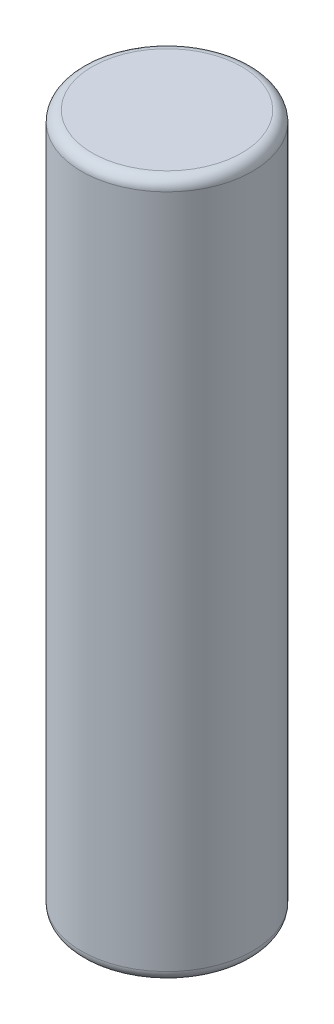
ISO-10303-21;
HEADER;
FILE_DESCRIPTION(('STEP AP214'),'2;1');
FILE_NAME('part.step','',(''),(''),'','','');
FILE_SCHEMA(('AUTOMOTIVE_DESIGN { 1 0 10303 214 1 1 1 1 }'));
ENDSEC;
DATA;
#1=APPLICATION_CONTEXT('core data for automotive mechanical design processes');
#2=APPLICATION_PROTOCOL_DEFINITION('international standard','automotive_design',2000,#1);
#3=PRODUCT_CONTEXT('',#1,'mechanical');
#4=PRODUCT('Part','Part','',(#3));
#5=PRODUCT_RELATED_PRODUCT_CATEGORY('part','',(#4));
#6=PRODUCT_DEFINITION_FORMATION('','',#4);
#7=PRODUCT_DEFINITION_CONTEXT('part definition',#1,'design');
#8=PRODUCT_DEFINITION('design','',#6,#7);
#9=PRODUCT_DEFINITION_SHAPE('','',#8);
#10=(LENGTH_UNIT() NAMED_UNIT(*) SI_UNIT(.MILLI.,.METRE.));
#11=(NAMED_UNIT(*) PLANE_ANGLE_UNIT() SI_UNIT($,.RADIAN.));
#12=(NAMED_UNIT(*) SI_UNIT($,.STERADIAN.) SOLID_ANGLE_UNIT());
#13=UNCERTAINTY_MEASURE_WITH_UNIT(LENGTH_MEASURE(1.E-05),#10,'distance_accuracy_value','');
#14=(GEOMETRIC_REPRESENTATION_CONTEXT(3) GLOBAL_UNCERTAINTY_ASSIGNED_CONTEXT((#13)) GLOBAL_UNIT_ASSIGNED_CONTEXT((#10,
#11,#12)) REPRESENTATION_CONTEXT('',''));
#15=CARTESIAN_POINT('',(0.,0.,0.));
#16=DIRECTION('',(0.,0.,1.));
#17=DIRECTION('',(1.,0.,0.));
#18=AXIS2_PLACEMENT_3D('',#15,#16,#17);
#19=CARTESIAN_POINT('',(11.3534361726395,-3.72409052550787,13.4331522968071));
#20=DIRECTION('',(0.,-1.,0.));
#21=DIRECTION('',(0.,0.,-1.));
#22=AXIS2_PLACEMENT_3D('',#19,#20,#21);
#23=PLANE('',#22);
#24=CARTESIAN_POINT('',(16.4622826667123,-3.72409052550787,8.32430580273434));
#25=DIRECTION('',(0.,-1.,0.));
#26=DIRECTION('',(0.707106781186561,0.,0.707106781186534));
#27=AXIS2_PLACEMENT_3D('',#24,#25,#26);
#28=CIRCLE('',#27,1.75000000000002);
#29=CARTESIAN_POINT('',(17.6997195337888,-3.72409052550787,9.56174266981079));
#30=VERTEX_POINT('',#29);
#31=EDGE_CURVE('E66',#30,#30,#28,.T.);
#32=ORIENTED_EDGE('',*,*,#31,.F.);
#33=EDGE_LOOP('',(#32));
#34=FACE_BOUND('',#33,.T.);
#35=ADVANCED_FACE('F15',(#34),#23,.F.);
#36=CARTESIAN_POINT('',(11.3534361726395,-20.0240909362223,13.4331522968071));
#37=DIRECTION('',(0.,-1.,0.));
#38=DIRECTION('',(0.,0.,-1.));
#39=AXIS2_PLACEMENT_3D('',#36,#37,#38);
#40=PLANE('',#39);
#41=CARTESIAN_POINT('',(16.4622826667123,-20.0240909362223,8.32430580273434));
#42=DIRECTION('',(0.,1.,0.));
#43=DIRECTION('',(0.707106781186558,0.,0.707106781186537));
#44=AXIS2_PLACEMENT_3D('',#41,#42,#43);
#45=CIRCLE('',#44,1.75000000000003);
#46=CARTESIAN_POINT('',(17.6997195337888,-20.0240909362223,9.5617426698108));
#47=VERTEX_POINT('',#46);
#48=EDGE_CURVE('E34',#47,#47,#45,.T.);
#49=ORIENTED_EDGE('',*,*,#48,.F.);
#50=EDGE_LOOP('',(#49));
#51=FACE_BOUND('',#50,.T.);
#52=ADVANCED_FACE('F80',(#51),#40,.T.);
#53=CARTESIAN_POINT('',(16.4622826667123,-3.97409052550787,8.32430580273434));
#54=DIRECTION('',(0.,-1.,0.));
#55=DIRECTION('',(-0.707106781186548,0.,-0.707106781186547));
#56=AXIS2_PLACEMENT_3D('',#53,#54,#55);
#57=TOROIDAL_SURFACE('',#56,1.75,0.25);
#58=ORIENTED_EDGE('',*,*,#31,.T.);
#59=EDGE_LOOP('',(#58));
#60=FACE_BOUND('',#59,.T.);
#61=CARTESIAN_POINT('',(16.4622826667123,-3.97409052550787,8.32430580273434));
#62=DIRECTION('',(0.,1.,0.));
#63=DIRECTION('',(-1.,0.,0.));
#64=AXIS2_PLACEMENT_3D('',#61,#62,#63);
#65=CIRCLE('',#64,2.);
#66=CARTESIAN_POINT('',(14.4622826667123,-3.97409052550787,8.32430580273434));
#67=VERTEX_POINT('',#66);
#68=EDGE_CURVE('E26',#67,#67,#65,.F.);
#69=ORIENTED_EDGE('',*,*,#68,.F.);
#70=EDGE_LOOP('',(#69));
#71=FACE_BOUND('',#70,.T.);
#72=ADVANCED_FACE('F47',(#60,#71),#57,.T.);
#73=CARTESIAN_POINT('',(16.4622826667123,-19.7740909362223,8.32430580273434));
#74=DIRECTION('',(0.,-1.,0.));
#75=DIRECTION('',(-0.707106781186548,0.,-0.707106781186547));
#76=AXIS2_PLACEMENT_3D('',#73,#74,#75);
#77=TOROIDAL_SURFACE('',#76,1.75,0.25);
#78=CARTESIAN_POINT('',(16.4622826667123,-19.7740909362223,8.32430580273434));
#79=DIRECTION('',(0.,1.,0.));
#80=DIRECTION('',(-1.,0.,0.));
#81=AXIS2_PLACEMENT_3D('',#78,#79,#80);
#82=CIRCLE('',#81,2.);
#83=CARTESIAN_POINT('',(14.4622826667123,-19.7740909362223,8.32430580273434));
#84=VERTEX_POINT('',#83);
#85=EDGE_CURVE('E10',#84,#84,#82,.T.);
#86=ORIENTED_EDGE('',*,*,#85,.F.);
#87=EDGE_LOOP('',(#86));
#88=FACE_BOUND('',#87,.T.);
#89=ORIENTED_EDGE('',*,*,#48,.T.);
#90=EDGE_LOOP('',(#89));
#91=FACE_BOUND('',#90,.T.);
#92=ADVANCED_FACE('F42',(#88,#91),#77,.T.);
#93=CARTESIAN_POINT('',(16.4622826667123,-21.020500867386,8.32430580273434));
#94=DIRECTION('',(0.,1.,0.));
#95=DIRECTION('',(-1.,0.,0.));
#96=AXIS2_PLACEMENT_3D('',#93,#94,#95);
#97=CYLINDRICAL_SURFACE('',#96,2.);
#98=ORIENTED_EDGE('',*,*,#85,.T.);
#99=EDGE_LOOP('',(#98));
#100=FACE_BOUND('',#99,.T.);
#101=ORIENTED_EDGE('',*,*,#68,.T.);
#102=EDGE_LOOP('',(#101));
#103=FACE_BOUND('',#102,.T.);
#104=ADVANCED_FACE('F46',(#100,#103),#97,.T.);
#105=CLOSED_SHELL('',(#35,#52,#72,#92,#104));
#106=MANIFOLD_SOLID_BREP('B1',#105);
#107=ADVANCED_BREP_SHAPE_REPRESENTATION('',(#18,#106),#14);
#108=SHAPE_DEFINITION_REPRESENTATION(#9,#107);
ENDSEC;
END-ISO-10303-21;
